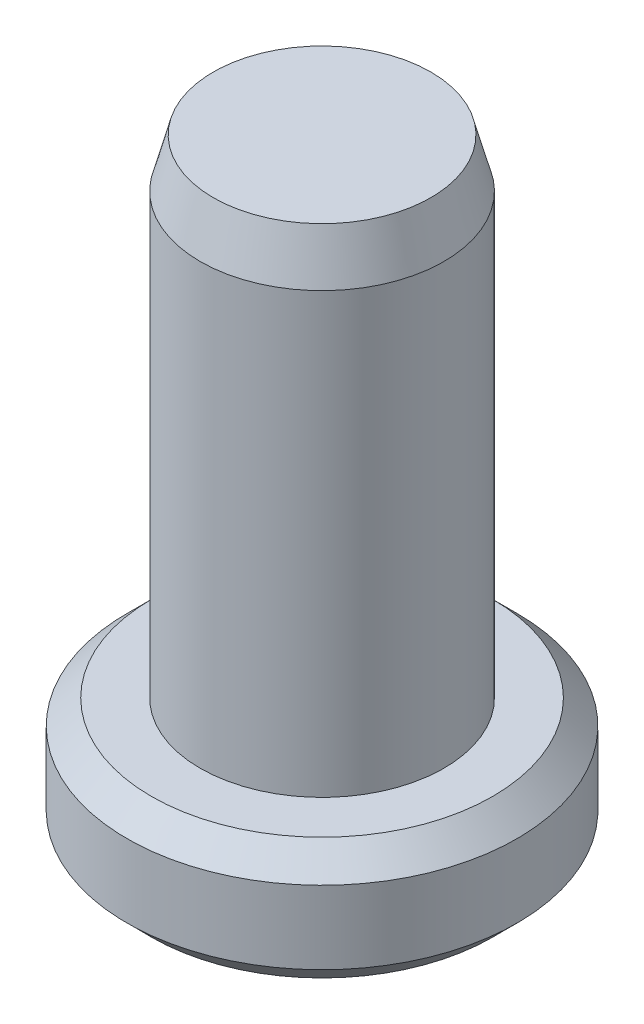
ISO-10303-21;
HEADER;
FILE_DESCRIPTION(('STEP AP214'),'2;1');
FILE_NAME('part.step','',(''),(''),'','','');
FILE_SCHEMA(('AUTOMOTIVE_DESIGN { 1 0 10303 214 1 1 1 1 }'));
ENDSEC;
DATA;
#1=APPLICATION_CONTEXT('core data for automotive mechanical design processes');
#2=APPLICATION_PROTOCOL_DEFINITION('international standard','automotive_design',2000,#1);
#3=PRODUCT_CONTEXT('',#1,'mechanical');
#4=PRODUCT('Part','Part','',(#3));
#5=PRODUCT_RELATED_PRODUCT_CATEGORY('part','',(#4));
#6=PRODUCT_DEFINITION_FORMATION('','',#4);
#7=PRODUCT_DEFINITION_CONTEXT('part definition',#1,'design');
#8=PRODUCT_DEFINITION('design','',#6,#7);
#9=PRODUCT_DEFINITION_SHAPE('','',#8);
#10=(LENGTH_UNIT() NAMED_UNIT(*) SI_UNIT(.MILLI.,.METRE.));
#11=(NAMED_UNIT(*) PLANE_ANGLE_UNIT() SI_UNIT($,.RADIAN.));
#12=(NAMED_UNIT(*) SI_UNIT($,.STERADIAN.) SOLID_ANGLE_UNIT());
#13=UNCERTAINTY_MEASURE_WITH_UNIT(LENGTH_MEASURE(1.E-05),#10,'distance_accuracy_value','');
#14=(GEOMETRIC_REPRESENTATION_CONTEXT(3) GLOBAL_UNCERTAINTY_ASSIGNED_CONTEXT((#13)) GLOBAL_UNIT_ASSIGNED_CONTEXT((#10,
#11,#12)) REPRESENTATION_CONTEXT('',''));
#15=CARTESIAN_POINT('',(0.,0.,0.));
#16=DIRECTION('',(0.,0.,1.));
#17=DIRECTION('',(1.,0.,0.));
#18=AXIS2_PLACEMENT_3D('',#15,#16,#17);
#19=CARTESIAN_POINT('',(0.,20.,0.));
#20=DIRECTION('',(0.,-1.,0.));
#21=DIRECTION('',(0.,0.,-1.));
#22=AXIS2_PLACEMENT_3D('',#19,#20,#21);
#23=CYLINDRICAL_SURFACE('',#22,5.);
#24=CARTESIAN_POINT('',(0.,18.,0.));
#25=DIRECTION('',(0.,1.,0.));
#26=DIRECTION('',(0.,0.,1.));
#27=AXIS2_PLACEMENT_3D('',#24,#25,#26);
#28=CIRCLE('',#27,5.);
#29=CARTESIAN_POINT('',(0.,18.,5.));
#30=VERTEX_POINT('',#29);
#31=EDGE_CURVE('E61',#30,#30,#28,.F.);
#32=ORIENTED_EDGE('',*,*,#31,.T.);
#33=EDGE_LOOP('',(#32));
#34=FACE_BOUND('',#33,.T.);
#35=CARTESIAN_POINT('',(0.,0.,0.));
#36=DIRECTION('',(0.,1.,0.));
#37=DIRECTION('',(0.,0.,1.));
#38=AXIS2_PLACEMENT_3D('',#35,#36,#37);
#39=CIRCLE('',#38,5.);
#40=CARTESIAN_POINT('',(0.,0.,5.));
#41=VERTEX_POINT('',#40);
#42=EDGE_CURVE('E69',#41,#41,#39,.T.);
#43=ORIENTED_EDGE('',*,*,#42,.T.);
#44=EDGE_LOOP('',(#43));
#45=FACE_BOUND('',#44,.T.);
#46=ADVANCED_FACE('F37',(#34,#45),#23,.T.);
#47=CARTESIAN_POINT('',(0.,20.,0.));
#48=DIRECTION('',(0.,1.,0.));
#49=DIRECTION('',(0.,0.,1.));
#50=AXIS2_PLACEMENT_3D('',#47,#48,#49);
#51=PLANE('',#50);
#52=CARTESIAN_POINT('',(0.,20.,0.));
#53=DIRECTION('',(0.,1.,0.));
#54=DIRECTION('',(0.,0.,1.));
#55=AXIS2_PLACEMENT_3D('',#52,#53,#54);
#56=CIRCLE('',#55,4.46410161513775);
#57=CARTESIAN_POINT('',(0.,20.,4.46410161513775));
#58=VERTEX_POINT('',#57);
#59=EDGE_CURVE('E65',#58,#58,#56,.T.);
#60=ORIENTED_EDGE('',*,*,#59,.T.);
#61=EDGE_LOOP('',(#60));
#62=FACE_BOUND('',#61,.T.);
#63=ADVANCED_FACE('F90',(#62),#51,.T.);
#64=CARTESIAN_POINT('',(0.,20.,0.));
#65=DIRECTION('',(0.,-1.,0.));
#66=DIRECTION('',(0.,0.,-1.));
#67=AXIS2_PLACEMENT_3D('',#64,#65,#66);
#68=CONICAL_SURFACE('',#67,4.46410161513775,0.261799387799146);
#69=ORIENTED_EDGE('',*,*,#31,.F.);
#70=EDGE_LOOP('',(#69));
#71=FACE_BOUND('',#70,.T.);
#72=ORIENTED_EDGE('',*,*,#59,.F.);
#73=EDGE_LOOP('',(#72));
#74=FACE_BOUND('',#73,.T.);
#75=ADVANCED_FACE('F96',(#71,#74),#68,.T.);
#76=CARTESIAN_POINT('',(0.,-5.,0.));
#77=DIRECTION('',(0.,1.,0.));
#78=DIRECTION('',(0.,0.,1.));
#79=AXIS2_PLACEMENT_3D('',#76,#77,#78);
#80=CYLINDRICAL_SURFACE('',#79,8.);
#81=CARTESIAN_POINT('',(0.,-4.00000000000001,0.));
#82=DIRECTION('',(0.,-1.,0.));
#83=DIRECTION('',(0.,0.,-1.));
#84=AXIS2_PLACEMENT_3D('',#81,#82,#83);
#85=CIRCLE('',#84,8.);
#86=CARTESIAN_POINT('',(0.,-4.00000000000001,-8.));
#87=VERTEX_POINT('',#86);
#88=EDGE_CURVE('E45',#87,#87,#85,.F.);
#89=ORIENTED_EDGE('',*,*,#88,.T.);
#90=EDGE_LOOP('',(#89));
#91=FACE_BOUND('',#90,.T.);
#92=CARTESIAN_POINT('',(0.,-0.999999999999997,0.));
#93=DIRECTION('',(0.,-1.,0.));
#94=DIRECTION('',(0.,0.,-1.));
#95=AXIS2_PLACEMENT_3D('',#92,#93,#94);
#96=CIRCLE('',#95,8.);
#97=CARTESIAN_POINT('',(0.,-0.999999999999997,-8.));
#98=VERTEX_POINT('',#97);
#99=EDGE_CURVE('E50',#98,#98,#96,.T.);
#100=ORIENTED_EDGE('',*,*,#99,.T.);
#101=EDGE_LOOP('',(#100));
#102=FACE_BOUND('',#101,.T.);
#103=ADVANCED_FACE('F85',(#91,#102),#80,.T.);
#104=CARTESIAN_POINT('',(0.,-5.,0.));
#105=DIRECTION('',(0.,-1.,0.));
#106=DIRECTION('',(0.,0.,-1.));
#107=AXIS2_PLACEMENT_3D('',#104,#105,#106);
#108=PLANE('',#107);
#109=CARTESIAN_POINT('',(0.,-5.,0.));
#110=DIRECTION('',(0.,-1.,0.));
#111=DIRECTION('',(0.,0.,-1.));
#112=AXIS2_PLACEMENT_3D('',#109,#110,#111);
#113=CIRCLE('',#112,7.00000000000001);
#114=CARTESIAN_POINT('',(0.,-5.,-7.00000000000001));
#115=VERTEX_POINT('',#114);
#116=EDGE_CURVE('E55',#115,#115,#113,.T.);
#117=ORIENTED_EDGE('',*,*,#116,.T.);
#118=EDGE_LOOP('',(#117));
#119=FACE_BOUND('',#118,.T.);
#120=ADVANCED_FACE('F78',(#119),#108,.T.);
#121=CARTESIAN_POINT('',(0.,0.,0.));
#122=DIRECTION('',(0.,-1.,0.));
#123=DIRECTION('',(0.,0.,-1.));
#124=AXIS2_PLACEMENT_3D('',#121,#122,#123);
#125=PLANE('',#124);
#126=CARTESIAN_POINT('',(0.,0.,0.));
#127=DIRECTION('',(0.,-1.,0.));
#128=DIRECTION('',(0.,0.,-1.));
#129=AXIS2_PLACEMENT_3D('',#126,#127,#128);
#130=CIRCLE('',#129,7.);
#131=CARTESIAN_POINT('',(0.,0.,-7.));
#132=VERTEX_POINT('',#131);
#133=EDGE_CURVE('E10',#132,#132,#130,.F.);
#134=ORIENTED_EDGE('',*,*,#133,.T.);
#135=EDGE_LOOP('',(#134));
#136=FACE_BOUND('',#135,.T.);
#137=ORIENTED_EDGE('',*,*,#42,.F.);
#138=EDGE_LOOP('',(#137));
#139=FACE_BOUND('',#138,.T.);
#140=ADVANCED_FACE('F75',(#136,#139),#125,.F.);
#141=CARTESIAN_POINT('',(0.,-5.,0.));
#142=DIRECTION('',(0.,1.,0.));
#143=DIRECTION('',(0.,0.,1.));
#144=AXIS2_PLACEMENT_3D('',#141,#142,#143);
#145=CONICAL_SURFACE('',#144,7.00000000000001,0.785398163397448);
#146=ORIENTED_EDGE('',*,*,#88,.F.);
#147=EDGE_LOOP('',(#146));
#148=FACE_BOUND('',#147,.T.);
#149=ORIENTED_EDGE('',*,*,#116,.F.);
#150=EDGE_LOOP('',(#149));
#151=FACE_BOUND('',#150,.T.);
#152=ADVANCED_FACE('F77',(#148,#151),#145,.T.);
#153=CARTESIAN_POINT('',(0.,-0.999999999999997,0.));
#154=DIRECTION('',(0.,-1.,0.));
#155=DIRECTION('',(0.,0.,-1.));
#156=AXIS2_PLACEMENT_3D('',#153,#154,#155);
#157=CONICAL_SURFACE('',#156,8.,0.78539816339745);
#158=ORIENTED_EDGE('',*,*,#133,.F.);
#159=EDGE_LOOP('',(#158));
#160=FACE_BOUND('',#159,.T.);
#161=ORIENTED_EDGE('',*,*,#99,.F.);
#162=EDGE_LOOP('',(#161));
#163=FACE_BOUND('',#162,.T.);
#164=ADVANCED_FACE('F39',(#160,#163),#157,.T.);
#165=CLOSED_SHELL('',(#46,#63,#75,#103,#120,#140,#152,#164));
#166=MANIFOLD_SOLID_BREP('B2',#165);
#167=ADVANCED_BREP_SHAPE_REPRESENTATION('',(#18,#166),#14);
#168=SHAPE_DEFINITION_REPRESENTATION(#9,#167);
ENDSEC;
END-ISO-10303-21;
